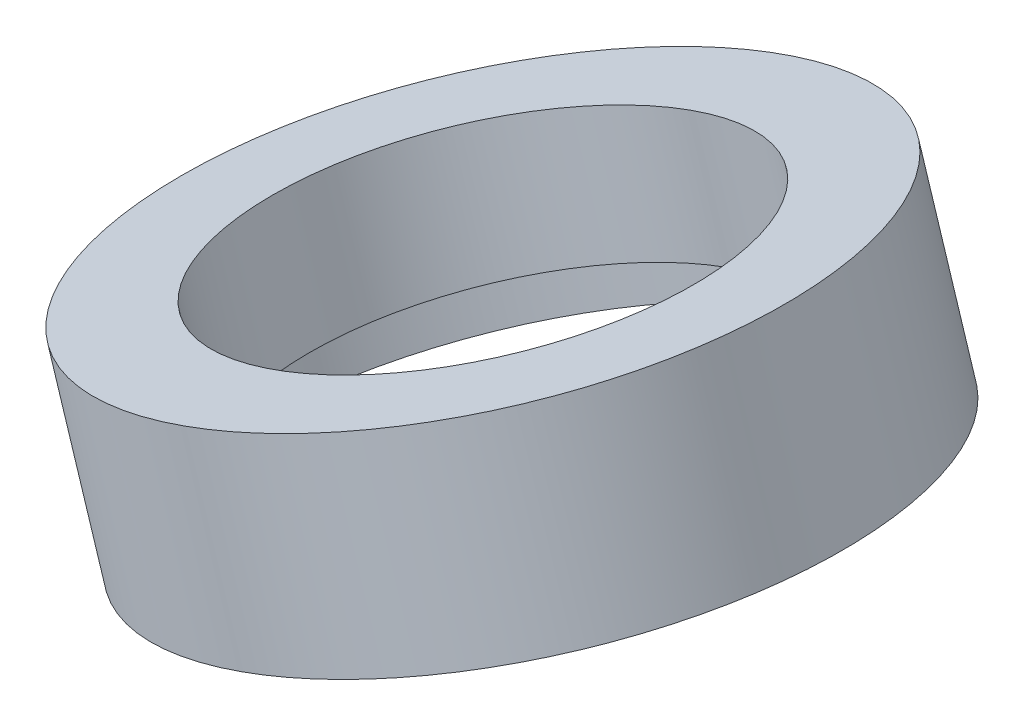
ISO-10303-21;
HEADER;
FILE_DESCRIPTION(('STEP AP214'),'2;1');
FILE_NAME('part.step','',(''),(''),'','','');
FILE_SCHEMA(('AUTOMOTIVE_DESIGN { 1 0 10303 214 1 1 1 1 }'));
ENDSEC;
DATA;
#1=APPLICATION_CONTEXT('core data for automotive mechanical design processes');
#2=APPLICATION_PROTOCOL_DEFINITION('international standard','automotive_design',2000,#1);
#3=PRODUCT_CONTEXT('',#1,'mechanical');
#4=PRODUCT('Part','Part','',(#3));
#5=PRODUCT_RELATED_PRODUCT_CATEGORY('part','',(#4));
#6=PRODUCT_DEFINITION_FORMATION('','',#4);
#7=PRODUCT_DEFINITION_CONTEXT('part definition',#1,'design');
#8=PRODUCT_DEFINITION('design','',#6,#7);
#9=PRODUCT_DEFINITION_SHAPE('','',#8);
#10=(LENGTH_UNIT() NAMED_UNIT(*) SI_UNIT(.MILLI.,.METRE.));
#11=(NAMED_UNIT(*) PLANE_ANGLE_UNIT() SI_UNIT($,.RADIAN.));
#12=(NAMED_UNIT(*) SI_UNIT($,.STERADIAN.) SOLID_ANGLE_UNIT());
#13=UNCERTAINTY_MEASURE_WITH_UNIT(LENGTH_MEASURE(1.E-05),#10,'distance_accuracy_value','');
#14=(GEOMETRIC_REPRESENTATION_CONTEXT(3) GLOBAL_UNCERTAINTY_ASSIGNED_CONTEXT((#13)) GLOBAL_UNIT_ASSIGNED_CONTEXT((#10,
#11,#12)) REPRESENTATION_CONTEXT('',''));
#15=CARTESIAN_POINT('',(0.,0.,0.));
#16=DIRECTION('',(0.,0.,1.));
#17=DIRECTION('',(1.,0.,0.));
#18=AXIS2_PLACEMENT_3D('',#15,#16,#17);
#19=CARTESIAN_POINT('',(358.278571520627,555.511428279475,0.));
#20=DIRECTION('',(-0.300714282645775,0.953714275982507,0.));
#21=DIRECTION('',(-0.953714275982507,-0.300714282645775,0.));
#22=AXIS2_PLACEMENT_3D('',#19,#20,#21);
#23=CYLINDRICAL_SURFACE('',#22,14.3);
#24=CARTESIAN_POINT('',(362.187857195022,543.113142691702,0.));
#25=DIRECTION('',(-0.300714282645775,0.953714275982507,0.));
#26=DIRECTION('',(-0.953714275982507,-0.300714282645775,0.));
#27=AXIS2_PLACEMENT_3D('',#24,#25,#26);
#28=CIRCLE('',#27,14.3);
#29=CARTESIAN_POINT('',(348.549743048472,538.812928449868,0.));
#30=VERTEX_POINT('',#29);
#31=EDGE_CURVE('E55',#30,#30,#28,.T.);
#32=ORIENTED_EDGE('',*,*,#31,.F.);
#33=EDGE_LOOP('',(#32));
#34=FACE_BOUND('',#33,.T.);
#35=CARTESIAN_POINT('',(359.782142933856,550.742856899563,0.));
#36=DIRECTION('',(-0.300714282645775,0.953714275982507,0.));
#37=DIRECTION('',(-0.953714275982507,-0.300714282645775,0.));
#38=AXIS2_PLACEMENT_3D('',#35,#36,#37);
#39=CIRCLE('',#38,14.3000000000001);
#40=CARTESIAN_POINT('',(346.144028787306,546.442642657728,0.));
#41=VERTEX_POINT('',#40);
#42=EDGE_CURVE('E10',#41,#41,#39,.T.);
#43=ORIENTED_EDGE('',*,*,#42,.T.);
#44=EDGE_LOOP('',(#43));
#45=FACE_BOUND('',#44,.T.);
#46=ADVANCED_FACE('F33',(#34,#45),#23,.F.);
#47=CARTESIAN_POINT('',(373.420257080406,555.043071141397,0.));
#48=DIRECTION('',(0.300714282645775,-0.953714275982507,0.));
#49=DIRECTION('',(0.953714275982507,0.300714282645775,0.));
#50=AXIS2_PLACEMENT_3D('',#47,#48,#49);
#51=PLANE('',#50);
#52=ORIENTED_EDGE('',*,*,#42,.F.);
#53=EDGE_LOOP('',(#52));
#54=FACE_BOUND('',#53,.T.);
#55=CARTESIAN_POINT('',(359.782142933856,550.742856899563,0.));
#56=DIRECTION('',(-0.300714282645775,0.953714275982507,0.));
#57=DIRECTION('',(-0.953714275982507,-0.300714282645775,0.));
#58=AXIS2_PLACEMENT_3D('',#55,#56,#57);
#59=CIRCLE('',#58,20.5);
#60=CARTESIAN_POINT('',(340.231000276214,544.578214105324,0.));
#61=VERTEX_POINT('',#60);
#62=EDGE_CURVE('E39',#61,#61,#59,.T.);
#63=ORIENTED_EDGE('',*,*,#62,.T.);
#64=EDGE_LOOP('',(#63));
#65=FACE_BOUND('',#64,.T.);
#66=ADVANCED_FACE('F62',(#54,#65),#51,.F.);
#67=CARTESIAN_POINT('',(358.278571520627,555.511428279475,0.));
#68=DIRECTION('',(-0.300714282645775,0.953714275982507,0.));
#69=DIRECTION('',(-0.953714275982507,-0.300714282645775,0.));
#70=AXIS2_PLACEMENT_3D('',#67,#68,#69);
#71=CYLINDRICAL_SURFACE('',#70,20.5);
#72=ORIENTED_EDGE('',*,*,#62,.F.);
#73=EDGE_LOOP('',(#72));
#74=FACE_BOUND('',#73,.T.);
#75=CARTESIAN_POINT('',(363.541071466928,538.821428449781,0.));
#76=DIRECTION('',(-0.300714282645775,0.953714275982507,0.));
#77=DIRECTION('',(-0.953714275982507,-0.300714282645775,0.));
#78=AXIS2_PLACEMENT_3D('',#75,#76,#77);
#79=CIRCLE('',#78,20.5);
#80=CARTESIAN_POINT('',(343.989928809286,532.656785655543,0.));
#81=VERTEX_POINT('',#80);
#82=EDGE_CURVE('E43',#81,#81,#79,.T.);
#83=ORIENTED_EDGE('',*,*,#82,.T.);
#84=EDGE_LOOP('',(#83));
#85=FACE_BOUND('',#84,.T.);
#86=ADVANCED_FACE('F66',(#74,#85),#71,.T.);
#87=CARTESIAN_POINT('',(383.092214124569,544.98607124402,0.));
#88=DIRECTION('',(-0.300714282645775,0.953714275982507,0.));
#89=DIRECTION('',(-0.953714275982507,-0.300714282645775,0.));
#90=AXIS2_PLACEMENT_3D('',#87,#88,#89);
#91=PLANE('',#90);
#92=ORIENTED_EDGE('',*,*,#82,.F.);
#93=EDGE_LOOP('',(#92));
#94=FACE_BOUND('',#93,.T.);
#95=CARTESIAN_POINT('',(363.541071466928,538.821428449781,0.));
#96=DIRECTION('',(-0.300714282645775,0.953714275982507,0.));
#97=DIRECTION('',(-0.953714275982507,-0.300714282645775,0.));
#98=AXIS2_PLACEMENT_3D('',#95,#96,#97);
#99=CIRCLE('',#98,19.6);
#100=CARTESIAN_POINT('',(344.848271657671,532.927428509924,0.));
#101=VERTEX_POINT('',#100);
#102=EDGE_CURVE('E47',#101,#101,#99,.T.);
#103=ORIENTED_EDGE('',*,*,#102,.T.);
#104=EDGE_LOOP('',(#103));
#105=FACE_BOUND('',#104,.T.);
#106=ADVANCED_FACE('F71',(#94,#105),#91,.F.);
#107=CARTESIAN_POINT('',(358.278571520627,555.511428279475,0.));
#108=DIRECTION('',(-0.300714282645775,0.953714275982507,0.));
#109=DIRECTION('',(-0.953714275982507,-0.300714282645775,0.));
#110=AXIS2_PLACEMENT_3D('',#107,#108,#109);
#111=CYLINDRICAL_SURFACE('',#110,19.6);
#112=ORIENTED_EDGE('',*,*,#102,.F.);
#113=EDGE_LOOP('',(#112));
#114=FACE_BOUND('',#113,.T.);
#115=CARTESIAN_POINT('',(362.187857195022,543.113142691703,0.));
#116=DIRECTION('',(-0.300714282645775,0.953714275982507,0.));
#117=DIRECTION('',(-0.953714275982507,-0.300714282645775,0.));
#118=AXIS2_PLACEMENT_3D('',#115,#116,#117);
#119=CIRCLE('',#118,19.6);
#120=CARTESIAN_POINT('',(343.495057385765,537.219142751845,0.));
#121=VERTEX_POINT('',#120);
#122=EDGE_CURVE('E52',#121,#121,#119,.T.);
#123=ORIENTED_EDGE('',*,*,#122,.T.);
#124=EDGE_LOOP('',(#123));
#125=FACE_BOUND('',#124,.T.);
#126=ADVANCED_FACE('F77',(#114,#125),#111,.F.);
#127=CARTESIAN_POINT('',(380.880657004279,549.00714263156,0.));
#128=DIRECTION('',(-0.300714282645775,0.953714275982507,0.));
#129=DIRECTION('',(-0.953714275982507,-0.300714282645775,0.));
#130=AXIS2_PLACEMENT_3D('',#127,#128,#129);
#131=PLANE('',#130);
#132=ORIENTED_EDGE('',*,*,#122,.F.);
#133=EDGE_LOOP('',(#132));
#134=FACE_BOUND('',#133,.T.);
#135=ORIENTED_EDGE('',*,*,#31,.T.);
#136=EDGE_LOOP('',(#135));
#137=FACE_BOUND('',#136,.T.);
#138=ADVANCED_FACE('F59',(#134,#137),#131,.F.);
#139=CLOSED_SHELL('',(#46,#66,#86,#106,#126,#138));
#140=MANIFOLD_SOLID_BREP('B2',#139);
#141=ADVANCED_BREP_SHAPE_REPRESENTATION('',(#18,#140),#14);
#142=SHAPE_DEFINITION_REPRESENTATION(#9,#141);
ENDSEC;
END-ISO-10303-21;
